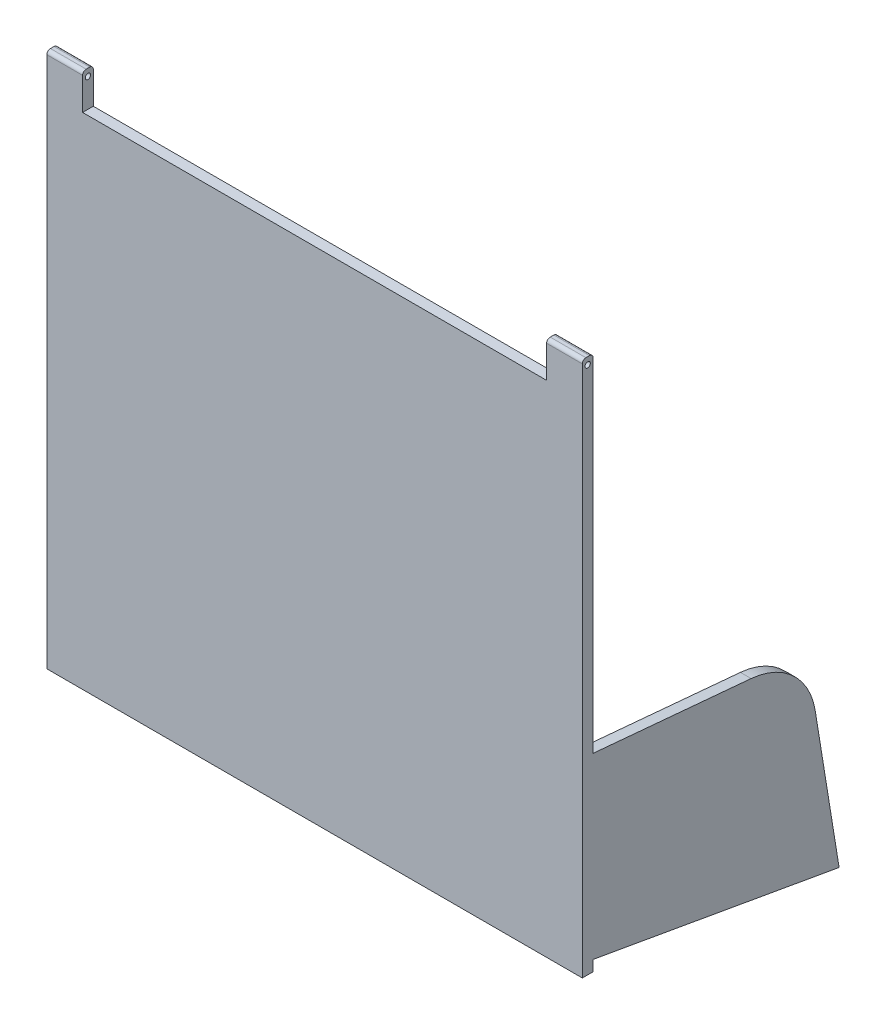
ISO-10303-21;
HEADER;
FILE_DESCRIPTION(('STEP AP214'),'2;1');
FILE_NAME('part.step','',(''),(''),'','','');
FILE_SCHEMA(('AUTOMOTIVE_DESIGN { 1 0 10303 214 1 1 1 1 }'));
ENDSEC;
DATA;
#1=APPLICATION_CONTEXT('core data for automotive mechanical design processes');
#2=APPLICATION_PROTOCOL_DEFINITION('international standard','automotive_design',2000,#1);
#3=PRODUCT_CONTEXT('',#1,'mechanical');
#4=PRODUCT('Part','Part','',(#3));
#5=PRODUCT_RELATED_PRODUCT_CATEGORY('part','',(#4));
#6=PRODUCT_DEFINITION_FORMATION('','',#4);
#7=PRODUCT_DEFINITION_CONTEXT('part definition',#1,'design');
#8=PRODUCT_DEFINITION('design','',#6,#7);
#9=PRODUCT_DEFINITION_SHAPE('','',#8);
#10=(LENGTH_UNIT() NAMED_UNIT(*) SI_UNIT(.MILLI.,.METRE.));
#11=(NAMED_UNIT(*) PLANE_ANGLE_UNIT() SI_UNIT($,.RADIAN.));
#12=(NAMED_UNIT(*) SI_UNIT($,.STERADIAN.) SOLID_ANGLE_UNIT());
#13=UNCERTAINTY_MEASURE_WITH_UNIT(LENGTH_MEASURE(1.E-05),#10,'distance_accuracy_value','');
#14=(GEOMETRIC_REPRESENTATION_CONTEXT(3) GLOBAL_UNCERTAINTY_ASSIGNED_CONTEXT((#13)) GLOBAL_UNIT_ASSIGNED_CONTEXT((#10,
#11,#12)) REPRESENTATION_CONTEXT('',''));
#15=CARTESIAN_POINT('',(0.,0.,0.));
#16=DIRECTION('',(0.,0.,1.));
#17=DIRECTION('',(1.,0.,0.));
#18=AXIS2_PLACEMENT_3D('',#15,#16,#17);
#19=CARTESIAN_POINT('',(0.,0.,3.));
#20=DIRECTION('',(1.,0.,0.));
#21=DIRECTION('',(0.,0.,-1.));
#22=AXIS2_PLACEMENT_3D('',#19,#20,#21);
#23=PLANE('',#22);
#24=DIRECTION('',(0.,-0.0898159250307496,-0.995958382469303));
#25=VECTOR('',#24,1.);
#26=CARTESIAN_POINT('',(0.,53.,0.));
#27=LINE('',#26,#25);
#28=CARTESIAN_POINT('',(0.,53.,0.));
#29=VERTEX_POINT('',#28);
#30=CARTESIAN_POINT('',(0.,49.0059654552923,-44.2893861340478));
#31=VERTEX_POINT('',#30);
#32=EDGE_CURVE('E190',#29,#31,#27,.T.);
#33=ORIENTED_EDGE('',*,*,#32,.T.);
#34=CARTESIAN_POINT('',(0.,29.0867978059063,-42.4930676334329));
#35=DIRECTION('',(1.,0.,0.));
#36=DIRECTION('',(0.,0.,-1.));
#37=AXIS2_PLACEMENT_3D('',#34,#35,#36);
#38=CIRCLE('',#37,20.);
#39=CARTESIAN_POINT('',(0.,32.2792992757854,-62.2366218819672));
#40=VERTEX_POINT('',#39);
#41=EDGE_CURVE('E357',#31,#40,#38,.F.);
#42=ORIENTED_EDGE('',*,*,#41,.T.);
#43=DIRECTION('',(0.,-0.987177712426718,-0.159625073493956));
#44=VECTOR('',#43,1.);
#45=CARTESIAN_POINT('',(0.,47.611044498155,-59.7575029481582));
#46=LINE('',#45,#44);
#47=CARTESIAN_POINT('',(0.,-9.15537243668538,-68.9365427108545));
#48=VERTEX_POINT('',#47);
#49=EDGE_CURVE('E215',#40,#48,#46,.T.);
#50=ORIENTED_EDGE('',*,*,#49,.T.);
#51=DIRECTION('',(0.,0.173648177666934,0.984807753012208));
#52=VECTOR('',#51,1.);
#53=CARTESIAN_POINT('',(0.,-9.15537243668538,-68.9365427108545));
#54=LINE('',#53,#52);
#55=CARTESIAN_POINT('',(0.,3.,0.));
#56=VERTEX_POINT('',#55);
#57=EDGE_CURVE('E213',#48,#56,#54,.T.);
#58=ORIENTED_EDGE('',*,*,#57,.T.);
#59=DIRECTION('',(0.,-1.,0.));
#60=VECTOR('',#59,1.);
#61=CARTESIAN_POINT('',(0.,0.,0.));
#62=LINE('',#61,#60);
#63=CARTESIAN_POINT('',(0.,0.,0.));
#64=VERTEX_POINT('',#63);
#65=EDGE_CURVE('E281',#56,#64,#62,.T.);
#66=ORIENTED_EDGE('',*,*,#65,.T.);
#67=DIRECTION('',(0.,0.,-1.));
#68=VECTOR('',#67,1.);
#69=CARTESIAN_POINT('',(0.,0.,3.));
#70=LINE('',#69,#68);
#71=CARTESIAN_POINT('',(0.,0.,3.));
#72=VERTEX_POINT('',#71);
#73=EDGE_CURVE('E313',#72,#64,#70,.T.);
#74=ORIENTED_EDGE('',*,*,#73,.F.);
#75=DIRECTION('',(0.,-1.,0.));
#76=VECTOR('',#75,1.);
#77=CARTESIAN_POINT('',(0.,0.,3.));
#78=LINE('',#77,#76);
#79=CARTESIAN_POINT('',(0.,149.,3.));
#80=VERTEX_POINT('',#79);
#81=EDGE_CURVE('E289',#80,#72,#78,.T.);
#82=ORIENTED_EDGE('',*,*,#81,.F.);
#83=CARTESIAN_POINT('',(0.,149.,2.));
#84=DIRECTION('',(1.,0.,0.));
#85=DIRECTION('',(0.,0.,-1.));
#86=AXIS2_PLACEMENT_3D('',#83,#84,#85);
#87=CIRCLE('',#86,1.);
#88=CARTESIAN_POINT('',(0.,150.,2.));
#89=VERTEX_POINT('',#88);
#90=EDGE_CURVE('E323',#80,#89,#87,.F.);
#91=ORIENTED_EDGE('',*,*,#90,.T.);
#92=DIRECTION('',(0.,0.,-1.));
#93=VECTOR('',#92,1.);
#94=CARTESIAN_POINT('',(0.,150.,3.));
#95=LINE('',#94,#93);
#96=CARTESIAN_POINT('',(0.,150.,1.));
#97=VERTEX_POINT('',#96);
#98=EDGE_CURVE('E297',#89,#97,#95,.T.);
#99=ORIENTED_EDGE('',*,*,#98,.T.);
#100=CARTESIAN_POINT('',(0.,149.,1.));
#101=DIRECTION('',(1.,0.,0.));
#102=DIRECTION('',(0.,0.,-1.));
#103=AXIS2_PLACEMENT_3D('',#100,#101,#102);
#104=CIRCLE('',#103,1.);
#105=CARTESIAN_POINT('',(0.,149.,0.));
#106=VERTEX_POINT('',#105);
#107=EDGE_CURVE('E325',#97,#106,#104,.F.);
#108=ORIENTED_EDGE('',*,*,#107,.T.);
#109=EDGE_CURVE('E298',#106,#29,#62,.T.);
#110=ORIENTED_EDGE('',*,*,#109,.T.);
#111=EDGE_LOOP('',(#33,#42,#50,#58,#66,#74,#82,#91,#99,#108,#110));
#112=FACE_BOUND('',#111,.T.);
#113=CARTESIAN_POINT('',(0.,148.,1.5));
#114=DIRECTION('',(1.,0.,0.));
#115=DIRECTION('',(0.,0.,-1.));
#116=AXIS2_PLACEMENT_3D('',#113,#114,#115);
#117=CIRCLE('',#116,0.75);
#118=CARTESIAN_POINT('',(0.,148.,0.749999999999999));
#119=VERTEX_POINT('',#118);
#120=EDGE_CURVE('E258',#119,#119,#117,.F.);
#121=ORIENTED_EDGE('',*,*,#120,.F.);
#122=EDGE_LOOP('',(#121));
#123=FACE_BOUND('',#122,.T.);
#124=ADVANCED_FACE('F36',(#112,#123),#23,.F.);
#125=CARTESIAN_POINT('',(150.,0.,3.));
#126=DIRECTION('',(-1.,0.,0.));
#127=DIRECTION('',(0.,-1.,0.));
#128=AXIS2_PLACEMENT_3D('',#125,#126,#127);
#129=PLANE('',#128);
#130=DIRECTION('',(0.,0.987177712426718,0.159625073493956));
#131=VECTOR('',#130,1.);
#132=CARTESIAN_POINT('',(150.,47.611044498155,-59.7575029481582));
#133=LINE('',#132,#131);
#134=CARTESIAN_POINT('',(150.,-9.15537243668538,-68.9365427108545));
#135=VERTEX_POINT('',#134);
#136=CARTESIAN_POINT('',(150.,32.2792992757854,-62.2366218819672));
#137=VERTEX_POINT('',#136);
#138=EDGE_CURVE('E241',#135,#137,#133,.T.);
#139=ORIENTED_EDGE('',*,*,#138,.T.);
#140=CARTESIAN_POINT('',(150.,29.0867978059063,-42.4930676334329));
#141=DIRECTION('',(-1.,0.,0.));
#142=DIRECTION('',(0.,-1.,0.));
#143=AXIS2_PLACEMENT_3D('',#140,#141,#142);
#144=CIRCLE('',#143,20.);
#145=CARTESIAN_POINT('',(150.,49.0059654552923,-44.2893861340478));
#146=VERTEX_POINT('',#145);
#147=EDGE_CURVE('E58',#137,#146,#144,.F.);
#148=ORIENTED_EDGE('',*,*,#147,.T.);
#149=DIRECTION('',(0.,0.0898159250307496,0.995958382469303));
#150=VECTOR('',#149,1.);
#151=CARTESIAN_POINT('',(150.,53.,0.));
#152=LINE('',#151,#150);
#153=CARTESIAN_POINT('',(150.,53.,0.));
#154=VERTEX_POINT('',#153);
#155=EDGE_CURVE('E230',#146,#154,#152,.T.);
#156=ORIENTED_EDGE('',*,*,#155,.T.);
#157=DIRECTION('',(0.,1.,0.));
#158=VECTOR('',#157,1.);
#159=CARTESIAN_POINT('',(150.,0.,0.));
#160=LINE('',#159,#158);
#161=CARTESIAN_POINT('',(150.,149.,0.));
#162=VERTEX_POINT('',#161);
#163=EDGE_CURVE('E302',#154,#162,#160,.T.);
#164=ORIENTED_EDGE('',*,*,#163,.T.);
#165=CARTESIAN_POINT('',(150.,149.,1.));
#166=DIRECTION('',(-1.,0.,0.));
#167=DIRECTION('',(0.,-1.,0.));
#168=AXIS2_PLACEMENT_3D('',#165,#166,#167);
#169=CIRCLE('',#168,1.);
#170=CARTESIAN_POINT('',(150.,150.,1.));
#171=VERTEX_POINT('',#170);
#172=EDGE_CURVE('E351',#162,#171,#169,.F.);
#173=ORIENTED_EDGE('',*,*,#172,.T.);
#174=DIRECTION('',(0.,0.,-1.));
#175=VECTOR('',#174,1.);
#176=CARTESIAN_POINT('',(150.,150.,3.));
#177=LINE('',#176,#175);
#178=CARTESIAN_POINT('',(150.,150.,2.));
#179=VERTEX_POINT('',#178);
#180=EDGE_CURVE('E307',#179,#171,#177,.T.);
#181=ORIENTED_EDGE('',*,*,#180,.F.);
#182=CARTESIAN_POINT('',(150.,149.,2.));
#183=DIRECTION('',(-1.,0.,0.));
#184=DIRECTION('',(0.,-1.,0.));
#185=AXIS2_PLACEMENT_3D('',#182,#183,#184);
#186=CIRCLE('',#185,1.);
#187=CARTESIAN_POINT('',(150.,149.,3.));
#188=VERTEX_POINT('',#187);
#189=EDGE_CURVE('E353',#179,#188,#186,.F.);
#190=ORIENTED_EDGE('',*,*,#189,.T.);
#191=DIRECTION('',(0.,1.,0.));
#192=VECTOR('',#191,1.);
#193=CARTESIAN_POINT('',(150.,0.,3.));
#194=LINE('',#193,#192);
#195=CARTESIAN_POINT('',(150.,0.,3.));
#196=VERTEX_POINT('',#195);
#197=EDGE_CURVE('E294',#196,#188,#194,.T.);
#198=ORIENTED_EDGE('',*,*,#197,.F.);
#199=DIRECTION('',(0.,0.,-1.));
#200=VECTOR('',#199,1.);
#201=CARTESIAN_POINT('',(150.,0.,3.));
#202=LINE('',#201,#200);
#203=CARTESIAN_POINT('',(150.,0.,0.));
#204=VERTEX_POINT('',#203);
#205=EDGE_CURVE('E310',#196,#204,#202,.T.);
#206=ORIENTED_EDGE('',*,*,#205,.T.);
#207=CARTESIAN_POINT('',(150.,3.,0.));
#208=VERTEX_POINT('',#207);
#209=EDGE_CURVE('E292',#204,#208,#160,.T.);
#210=ORIENTED_EDGE('',*,*,#209,.T.);
#211=DIRECTION('',(0.,-0.173648177666934,-0.984807753012208));
#212=VECTOR('',#211,1.);
#213=CARTESIAN_POINT('',(150.,3.,0.));
#214=LINE('',#213,#212);
#215=EDGE_CURVE('E223',#208,#135,#214,.T.);
#216=ORIENTED_EDGE('',*,*,#215,.T.);
#217=EDGE_LOOP('',(#139,#148,#156,#164,#173,#181,#190,#198,#206,#210,#216));
#218=FACE_BOUND('',#217,.T.);
#219=CARTESIAN_POINT('',(150.,148.,1.5));
#220=DIRECTION('',(-1.,0.,0.));
#221=DIRECTION('',(0.,-1.,0.));
#222=AXIS2_PLACEMENT_3D('',#219,#220,#221);
#223=CIRCLE('',#222,0.75);
#224=CARTESIAN_POINT('',(150.,147.25,1.5));
#225=VERTEX_POINT('',#224);
#226=EDGE_CURVE('E255',#225,#225,#223,.F.);
#227=ORIENTED_EDGE('',*,*,#226,.F.);
#228=EDGE_LOOP('',(#227));
#229=FACE_BOUND('',#228,.T.);
#230=ADVANCED_FACE('F372',(#218,#229),#129,.F.);
#231=CARTESIAN_POINT('',(10.,150.,0.));
#232=DIRECTION('',(-1.,0.,0.));
#233=DIRECTION('',(0.,-1.,0.));
#234=AXIS2_PLACEMENT_3D('',#231,#232,#233);
#235=PLANE('',#234);
#236=DIRECTION('',(0.,-1.,0.));
#237=VECTOR('',#236,1.);
#238=CARTESIAN_POINT('',(10.,150.,0.));
#239=LINE('',#238,#237);
#240=CARTESIAN_POINT('',(10.,149.,0.));
#241=VERTEX_POINT('',#240);
#242=CARTESIAN_POINT('',(10.,140.,0.));
#243=VERTEX_POINT('',#242);
#244=EDGE_CURVE('E262',#241,#243,#239,.T.);
#245=ORIENTED_EDGE('',*,*,#244,.F.);
#246=CARTESIAN_POINT('',(10.,149.,1.));
#247=DIRECTION('',(-1.,0.,0.));
#248=DIRECTION('',(0.,-1.,0.));
#249=AXIS2_PLACEMENT_3D('',#246,#247,#248);
#250=CIRCLE('',#249,1.);
#251=CARTESIAN_POINT('',(10.,150.,1.));
#252=VERTEX_POINT('',#251);
#253=EDGE_CURVE('E334',#241,#252,#250,.F.);
#254=ORIENTED_EDGE('',*,*,#253,.T.);
#255=DIRECTION('',(0.,0.,1.));
#256=VECTOR('',#255,1.);
#257=CARTESIAN_POINT('',(10.,150.,0.));
#258=LINE('',#257,#256);
#259=CARTESIAN_POINT('',(10.,150.,2.));
#260=VERTEX_POINT('',#259);
#261=EDGE_CURVE('E278',#252,#260,#258,.T.);
#262=ORIENTED_EDGE('',*,*,#261,.T.);
#263=CARTESIAN_POINT('',(10.,149.,2.));
#264=DIRECTION('',(-1.,0.,0.));
#265=DIRECTION('',(0.,-1.,0.));
#266=AXIS2_PLACEMENT_3D('',#263,#264,#265);
#267=CIRCLE('',#266,1.);
#268=CARTESIAN_POINT('',(10.,149.,3.));
#269=VERTEX_POINT('',#268);
#270=EDGE_CURVE('E332',#260,#269,#267,.F.);
#271=ORIENTED_EDGE('',*,*,#270,.T.);
#272=DIRECTION('',(0.,-1.,0.));
#273=VECTOR('',#272,1.);
#274=CARTESIAN_POINT('',(10.,150.,3.));
#275=LINE('',#274,#273);
#276=CARTESIAN_POINT('',(10.,140.,3.));
#277=VERTEX_POINT('',#276);
#278=EDGE_CURVE('E261',#269,#277,#275,.T.);
#279=ORIENTED_EDGE('',*,*,#278,.T.);
#280=DIRECTION('',(0.,0.,1.));
#281=VECTOR('',#280,1.);
#282=CARTESIAN_POINT('',(10.,140.,0.));
#283=LINE('',#282,#281);
#284=EDGE_CURVE('E271',#243,#277,#283,.T.);
#285=ORIENTED_EDGE('',*,*,#284,.F.);
#286=EDGE_LOOP('',(#245,#254,#262,#271,#279,#285));
#287=FACE_BOUND('',#286,.T.);
#288=CARTESIAN_POINT('',(10.,148.,1.5));
#289=DIRECTION('',(-1.,0.,0.));
#290=DIRECTION('',(0.,-1.,0.));
#291=AXIS2_PLACEMENT_3D('',#288,#289,#290);
#292=CIRCLE('',#291,0.75);
#293=CARTESIAN_POINT('',(10.,147.25,1.5));
#294=VERTEX_POINT('',#293);
#295=EDGE_CURVE('E252',#294,#294,#292,.F.);
#296=ORIENTED_EDGE('',*,*,#295,.F.);
#297=EDGE_LOOP('',(#296));
#298=FACE_BOUND('',#297,.T.);
#299=ADVANCED_FACE('F396',(#287,#298),#235,.F.);
#300=CARTESIAN_POINT('',(140.,150.,0.));
#301=DIRECTION('',(1.,0.,0.));
#302=DIRECTION('',(0.,0.,-1.));
#303=AXIS2_PLACEMENT_3D('',#300,#301,#302);
#304=PLANE('',#303);
#305=DIRECTION('',(0.,1.,0.));
#306=VECTOR('',#305,1.);
#307=CARTESIAN_POINT('',(140.,150.,3.));
#308=LINE('',#307,#306);
#309=CARTESIAN_POINT('',(140.,140.,3.));
#310=VERTEX_POINT('',#309);
#311=CARTESIAN_POINT('',(140.,149.,3.));
#312=VERTEX_POINT('',#311);
#313=EDGE_CURVE('E265',#310,#312,#308,.T.);
#314=ORIENTED_EDGE('',*,*,#313,.T.);
#315=CARTESIAN_POINT('',(140.,149.,2.));
#316=DIRECTION('',(1.,0.,0.));
#317=DIRECTION('',(0.,0.,-1.));
#318=AXIS2_PLACEMENT_3D('',#315,#316,#317);
#319=CIRCLE('',#318,1.);
#320=CARTESIAN_POINT('',(140.,150.,2.));
#321=VERTEX_POINT('',#320);
#322=EDGE_CURVE('E344',#312,#321,#319,.F.);
#323=ORIENTED_EDGE('',*,*,#322,.T.);
#324=DIRECTION('',(0.,0.,1.));
#325=VECTOR('',#324,1.);
#326=CARTESIAN_POINT('',(140.,150.,0.));
#327=LINE('',#326,#325);
#328=CARTESIAN_POINT('',(140.,150.,1.));
#329=VERTEX_POINT('',#328);
#330=EDGE_CURVE('E282',#329,#321,#327,.T.);
#331=ORIENTED_EDGE('',*,*,#330,.F.);
#332=CARTESIAN_POINT('',(140.,149.,1.));
#333=DIRECTION('',(1.,0.,0.));
#334=DIRECTION('',(0.,0.,-1.));
#335=AXIS2_PLACEMENT_3D('',#332,#333,#334);
#336=CIRCLE('',#335,1.);
#337=CARTESIAN_POINT('',(140.,149.,0.));
#338=VERTEX_POINT('',#337);
#339=EDGE_CURVE('E342',#329,#338,#336,.F.);
#340=ORIENTED_EDGE('',*,*,#339,.T.);
#341=DIRECTION('',(0.,1.,0.));
#342=VECTOR('',#341,1.);
#343=CARTESIAN_POINT('',(140.,150.,0.));
#344=LINE('',#343,#342);
#345=CARTESIAN_POINT('',(140.,140.,0.));
#346=VERTEX_POINT('',#345);
#347=EDGE_CURVE('E268',#346,#338,#344,.T.);
#348=ORIENTED_EDGE('',*,*,#347,.F.);
#349=DIRECTION('',(0.,0.,1.));
#350=VECTOR('',#349,1.);
#351=CARTESIAN_POINT('',(140.,140.,0.));
#352=LINE('',#351,#350);
#353=EDGE_CURVE('E285',#346,#310,#352,.T.);
#354=ORIENTED_EDGE('',*,*,#353,.T.);
#355=EDGE_LOOP('',(#314,#323,#331,#340,#348,#354));
#356=FACE_BOUND('',#355,.T.);
#357=CARTESIAN_POINT('',(140.,148.,1.5));
#358=DIRECTION('',(1.,0.,0.));
#359=DIRECTION('',(0.,0.,-1.));
#360=AXIS2_PLACEMENT_3D('',#357,#358,#359);
#361=CIRCLE('',#360,0.75);
#362=CARTESIAN_POINT('',(140.,148.,0.749999999999999));
#363=VERTEX_POINT('',#362);
#364=EDGE_CURVE('E247',#363,#363,#361,.F.);
#365=ORIENTED_EDGE('',*,*,#364,.F.);
#366=EDGE_LOOP('',(#365));
#367=FACE_BOUND('',#366,.T.);
#368=ADVANCED_FACE('F470',(#356,#367),#304,.F.);
#369=CARTESIAN_POINT('',(0.,150.,3.));
#370=DIRECTION('',(0.,-1.,0.));
#371=DIRECTION('',(0.,0.,-1.));
#372=AXIS2_PLACEMENT_3D('',#369,#370,#371);
#373=PLANE('',#372);
#374=ORIENTED_EDGE('',*,*,#261,.F.);
#375=DIRECTION('',(-1.,0.,0.));
#376=VECTOR('',#375,1.);
#377=CARTESIAN_POINT('',(0.,150.,1.));
#378=LINE('',#377,#376);
#379=EDGE_CURVE('E320',#252,#97,#378,.T.);
#380=ORIENTED_EDGE('',*,*,#379,.T.);
#381=ORIENTED_EDGE('',*,*,#98,.F.);
#382=DIRECTION('',(-1.,0.,0.));
#383=VECTOR('',#382,1.);
#384=CARTESIAN_POINT('',(0.,150.,2.));
#385=LINE('',#384,#383);
#386=EDGE_CURVE('E316',#89,#260,#385,.F.);
#387=ORIENTED_EDGE('',*,*,#386,.T.);
#388=EDGE_LOOP('',(#374,#380,#381,#387));
#389=FACE_BOUND('',#388,.T.);
#390=ADVANCED_FACE('F460',(#389),#373,.F.);
#391=CARTESIAN_POINT('',(0.,0.,3.));
#392=DIRECTION('',(0.,1.,0.));
#393=DIRECTION('',(0.,0.,1.));
#394=AXIS2_PLACEMENT_3D('',#391,#392,#393);
#395=PLANE('',#394);
#396=DIRECTION('',(1.,0.,0.));
#397=VECTOR('',#396,1.);
#398=CARTESIAN_POINT('',(0.,0.,0.));
#399=LINE('',#398,#397);
#400=EDGE_CURVE('E300',#64,#204,#399,.T.);
#401=ORIENTED_EDGE('',*,*,#400,.T.);
#402=ORIENTED_EDGE('',*,*,#205,.F.);
#403=DIRECTION('',(1.,0.,0.));
#404=VECTOR('',#403,1.);
#405=CARTESIAN_POINT('',(0.,0.,3.));
#406=LINE('',#405,#404);
#407=EDGE_CURVE('E291',#72,#196,#406,.T.);
#408=ORIENTED_EDGE('',*,*,#407,.F.);
#409=ORIENTED_EDGE('',*,*,#73,.T.);
#410=EDGE_LOOP('',(#401,#402,#408,#409));
#411=FACE_BOUND('',#410,.T.);
#412=ADVANCED_FACE('F401',(#411),#395,.F.);
#413=ORIENTED_EDGE('',*,*,#330,.T.);
#414=DIRECTION('',(-1.,0.,0.));
#415=VECTOR('',#414,1.);
#416=CARTESIAN_POINT('',(0.,150.,2.));
#417=LINE('',#416,#415);
#418=EDGE_CURVE('E349',#321,#179,#417,.F.);
#419=ORIENTED_EDGE('',*,*,#418,.T.);
#420=ORIENTED_EDGE('',*,*,#180,.T.);
#421=DIRECTION('',(-1.,0.,0.));
#422=VECTOR('',#421,1.);
#423=CARTESIAN_POINT('',(140.,150.,1.));
#424=LINE('',#423,#422);
#425=EDGE_CURVE('E346',#171,#329,#424,.T.);
#426=ORIENTED_EDGE('',*,*,#425,.T.);
#427=EDGE_LOOP('',(#413,#419,#420,#426));
#428=FACE_BOUND('',#427,.T.);
#429=ADVANCED_FACE('F429',(#428),#373,.F.);
#430=CARTESIAN_POINT('',(0.,0.,3.));
#431=DIRECTION('',(0.,0.,-1.));
#432=DIRECTION('',(-1.,0.,0.));
#433=AXIS2_PLACEMENT_3D('',#430,#431,#432);
#434=PLANE('',#433);
#435=ORIENTED_EDGE('',*,*,#278,.F.);
#436=DIRECTION('',(-1.,0.,0.));
#437=VECTOR('',#436,1.);
#438=CARTESIAN_POINT('',(0.,149.,3.));
#439=LINE('',#438,#437);
#440=EDGE_CURVE('E339',#269,#80,#439,.T.);
#441=ORIENTED_EDGE('',*,*,#440,.T.);
#442=ORIENTED_EDGE('',*,*,#81,.T.);
#443=ORIENTED_EDGE('',*,*,#407,.T.);
#444=ORIENTED_EDGE('',*,*,#197,.T.);
#445=DIRECTION('',(-1.,0.,0.));
#446=VECTOR('',#445,1.);
#447=CARTESIAN_POINT('',(0.,149.,3.));
#448=LINE('',#447,#446);
#449=EDGE_CURVE('E336',#188,#312,#448,.T.);
#450=ORIENTED_EDGE('',*,*,#449,.T.);
#451=ORIENTED_EDGE('',*,*,#313,.F.);
#452=DIRECTION('',(1.,0.,0.));
#453=VECTOR('',#452,1.);
#454=CARTESIAN_POINT('',(10.,140.,3.));
#455=LINE('',#454,#453);
#456=EDGE_CURVE('E273',#277,#310,#455,.T.);
#457=ORIENTED_EDGE('',*,*,#456,.F.);
#458=EDGE_LOOP('',(#435,#441,#442,#443,#444,#450,#451,#457));
#459=FACE_BOUND('',#458,.T.);
#460=ADVANCED_FACE('F436',(#459),#434,.F.);
#461=CARTESIAN_POINT('',(0.,0.,0.));
#462=DIRECTION('',(0.,0.,-1.));
#463=DIRECTION('',(-1.,0.,0.));
#464=AXIS2_PLACEMENT_3D('',#461,#462,#463);
#465=PLANE('',#464);
#466=DIRECTION('',(-1.,0.,0.));
#467=VECTOR('',#466,1.);
#468=CARTESIAN_POINT('',(3.,3.,0.));
#469=LINE('',#468,#467);
#470=CARTESIAN_POINT('',(3.,3.,0.));
#471=VERTEX_POINT('',#470);
#472=EDGE_CURVE('E212',#471,#56,#469,.T.);
#473=ORIENTED_EDGE('',*,*,#472,.F.);
#474=DIRECTION('',(0.,1.,0.));
#475=VECTOR('',#474,1.);
#476=CARTESIAN_POINT('',(3.,3.,0.));
#477=LINE('',#476,#475);
#478=CARTESIAN_POINT('',(3.,53.,0.));
#479=VERTEX_POINT('',#478);
#480=EDGE_CURVE('E202',#471,#479,#477,.T.);
#481=ORIENTED_EDGE('',*,*,#480,.T.);
#482=DIRECTION('',(-1.,0.,0.));
#483=VECTOR('',#482,1.);
#484=CARTESIAN_POINT('',(3.,53.,0.));
#485=LINE('',#484,#483);
#486=EDGE_CURVE('E183',#479,#29,#485,.T.);
#487=ORIENTED_EDGE('',*,*,#486,.T.);
#488=ORIENTED_EDGE('',*,*,#109,.F.);
#489=DIRECTION('',(-1.,0.,0.));
#490=VECTOR('',#489,1.);
#491=CARTESIAN_POINT('',(10.,149.,0.));
#492=LINE('',#491,#490);
#493=EDGE_CURVE('E330',#106,#241,#492,.F.);
#494=ORIENTED_EDGE('',*,*,#493,.T.);
#495=ORIENTED_EDGE('',*,*,#244,.T.);
#496=DIRECTION('',(1.,0.,0.));
#497=VECTOR('',#496,1.);
#498=CARTESIAN_POINT('',(10.,140.,0.));
#499=LINE('',#498,#497);
#500=EDGE_CURVE('E264',#243,#346,#499,.T.);
#501=ORIENTED_EDGE('',*,*,#500,.T.);
#502=ORIENTED_EDGE('',*,*,#347,.T.);
#503=DIRECTION('',(-1.,0.,0.));
#504=VECTOR('',#503,1.);
#505=CARTESIAN_POINT('',(150.,149.,0.));
#506=LINE('',#505,#504);
#507=EDGE_CURVE('E327',#338,#162,#506,.F.);
#508=ORIENTED_EDGE('',*,*,#507,.T.);
#509=ORIENTED_EDGE('',*,*,#163,.F.);
#510=DIRECTION('',(1.,0.,0.));
#511=VECTOR('',#510,1.);
#512=CARTESIAN_POINT('',(147.,53.,0.));
#513=LINE('',#512,#511);
#514=CARTESIAN_POINT('',(147.,53.,0.));
#515=VERTEX_POINT('',#514);
#516=EDGE_CURVE('E244',#515,#154,#513,.T.);
#517=ORIENTED_EDGE('',*,*,#516,.F.);
#518=DIRECTION('',(0.,-1.,0.));
#519=VECTOR('',#518,1.);
#520=CARTESIAN_POINT('',(147.,53.,0.));
#521=LINE('',#520,#519);
#522=CARTESIAN_POINT('',(147.,3.,0.));
#523=VERTEX_POINT('',#522);
#524=EDGE_CURVE('E226',#515,#523,#521,.T.);
#525=ORIENTED_EDGE('',*,*,#524,.T.);
#526=DIRECTION('',(1.,0.,0.));
#527=VECTOR('',#526,1.);
#528=CARTESIAN_POINT('',(147.,3.,0.));
#529=LINE('',#528,#527);
#530=EDGE_CURVE('E238',#523,#208,#529,.T.);
#531=ORIENTED_EDGE('',*,*,#530,.T.);
#532=ORIENTED_EDGE('',*,*,#209,.F.);
#533=ORIENTED_EDGE('',*,*,#400,.F.);
#534=ORIENTED_EDGE('',*,*,#65,.F.);
#535=EDGE_LOOP('',(#473,#481,#487,#488,#494,#495,#501,#502,#508,#509,#517,#525,#531,#532,#533,#534));
#536=FACE_BOUND('',#535,.T.);
#537=ADVANCED_FACE('F209',(#536),#465,.T.);
#538=CARTESIAN_POINT('',(10.,140.,0.));
#539=DIRECTION('',(0.,-1.,0.));
#540=DIRECTION('',(0.,0.,-1.));
#541=AXIS2_PLACEMENT_3D('',#538,#539,#540);
#542=PLANE('',#541);
#543=ORIENTED_EDGE('',*,*,#456,.T.);
#544=ORIENTED_EDGE('',*,*,#353,.F.);
#545=ORIENTED_EDGE('',*,*,#500,.F.);
#546=ORIENTED_EDGE('',*,*,#284,.T.);
#547=EDGE_LOOP('',(#543,#544,#545,#546));
#548=FACE_BOUND('',#547,.T.);
#549=ADVANCED_FACE('F467',(#548),#542,.F.);
#550=CARTESIAN_POINT('',(163.,148.,1.5));
#551=DIRECTION('',(-1.,0.,0.));
#552=DIRECTION('',(0.,-1.,0.));
#553=AXIS2_PLACEMENT_3D('',#550,#551,#552);
#554=CYLINDRICAL_SURFACE('',#553,0.75);
#555=ORIENTED_EDGE('',*,*,#364,.T.);
#556=EDGE_LOOP('',(#555));
#557=FACE_BOUND('',#556,.T.);
#558=ORIENTED_EDGE('',*,*,#226,.T.);
#559=EDGE_LOOP('',(#558));
#560=FACE_BOUND('',#559,.T.);
#561=ADVANCED_FACE('F476',(#557,#560),#554,.F.);
#562=ORIENTED_EDGE('',*,*,#295,.T.);
#563=EDGE_LOOP('',(#562));
#564=FACE_BOUND('',#563,.T.);
#565=ORIENTED_EDGE('',*,*,#120,.T.);
#566=EDGE_LOOP('',(#565));
#567=FACE_BOUND('',#566,.T.);
#568=ADVANCED_FACE('F406',(#564,#567),#554,.F.);
#569=CARTESIAN_POINT('',(0.,149.,1.));
#570=DIRECTION('',(1.,0.,0.));
#571=DIRECTION('',(0.,0.,-1.));
#572=AXIS2_PLACEMENT_3D('',#569,#570,#571);
#573=CYLINDRICAL_SURFACE('',#572,1.);
#574=ORIENTED_EDGE('',*,*,#253,.F.);
#575=ORIENTED_EDGE('',*,*,#493,.F.);
#576=ORIENTED_EDGE('',*,*,#107,.F.);
#577=ORIENTED_EDGE('',*,*,#379,.F.);
#578=EDGE_LOOP('',(#574,#575,#576,#577));
#579=FACE_BOUND('',#578,.T.);
#580=ADVANCED_FACE('F402',(#579),#573,.T.);
#581=CARTESIAN_POINT('',(0.,149.,2.));
#582=DIRECTION('',(-1.,0.,0.));
#583=DIRECTION('',(0.,0.,1.));
#584=AXIS2_PLACEMENT_3D('',#581,#582,#583);
#585=CYLINDRICAL_SURFACE('',#584,1.);
#586=ORIENTED_EDGE('',*,*,#270,.F.);
#587=ORIENTED_EDGE('',*,*,#386,.F.);
#588=ORIENTED_EDGE('',*,*,#90,.F.);
#589=ORIENTED_EDGE('',*,*,#440,.F.);
#590=EDGE_LOOP('',(#586,#587,#588,#589));
#591=FACE_BOUND('',#590,.T.);
#592=ADVANCED_FACE('F405',(#591),#585,.T.);
#593=CARTESIAN_POINT('',(0.,149.,2.));
#594=DIRECTION('',(-1.,0.,0.));
#595=DIRECTION('',(0.,0.,1.));
#596=AXIS2_PLACEMENT_3D('',#593,#594,#595);
#597=CYLINDRICAL_SURFACE('',#596,1.);
#598=ORIENTED_EDGE('',*,*,#189,.F.);
#599=ORIENTED_EDGE('',*,*,#418,.F.);
#600=ORIENTED_EDGE('',*,*,#322,.F.);
#601=ORIENTED_EDGE('',*,*,#449,.F.);
#602=EDGE_LOOP('',(#598,#599,#600,#601));
#603=FACE_BOUND('',#602,.T.);
#604=ADVANCED_FACE('F410',(#603),#597,.T.);
#605=CARTESIAN_POINT('',(0.,149.,1.));
#606=DIRECTION('',(1.,0.,0.));
#607=DIRECTION('',(0.,0.,-1.));
#608=AXIS2_PLACEMENT_3D('',#605,#606,#607);
#609=CYLINDRICAL_SURFACE('',#608,1.);
#610=ORIENTED_EDGE('',*,*,#172,.F.);
#611=ORIENTED_EDGE('',*,*,#507,.F.);
#612=ORIENTED_EDGE('',*,*,#339,.F.);
#613=ORIENTED_EDGE('',*,*,#425,.F.);
#614=EDGE_LOOP('',(#610,#611,#612,#613));
#615=FACE_BOUND('',#614,.T.);
#616=ADVANCED_FACE('F414',(#615),#609,.T.);
#617=CARTESIAN_POINT('',(147.,53.,0.));
#618=DIRECTION('',(0.,0.995958382469303,-0.0898159250307496));
#619=DIRECTION('',(0.,0.0898159250307496,0.995958382469303));
#620=AXIS2_PLACEMENT_3D('',#617,#618,#619);
#621=PLANE('',#620);
#622=ORIENTED_EDGE('',*,*,#155,.F.);
#623=DIRECTION('',(1.,0.,0.));
#624=VECTOR('',#623,1.);
#625=CARTESIAN_POINT('',(147.,49.0059654552923,-44.2893861340478));
#626=LINE('',#625,#624);
#627=CARTESIAN_POINT('',(147.,49.0059654552923,-44.2893861340478));
#628=VERTEX_POINT('',#627);
#629=EDGE_CURVE('E44',#146,#628,#626,.F.);
#630=ORIENTED_EDGE('',*,*,#629,.T.);
#631=DIRECTION('',(0.,0.0898159250307496,0.995958382469303));
#632=VECTOR('',#631,1.);
#633=CARTESIAN_POINT('',(147.,53.,0.));
#634=LINE('',#633,#632);
#635=EDGE_CURVE('E236',#628,#515,#634,.T.);
#636=ORIENTED_EDGE('',*,*,#635,.T.);
#637=ORIENTED_EDGE('',*,*,#516,.T.);
#638=EDGE_LOOP('',(#622,#630,#636,#637));
#639=FACE_BOUND('',#638,.T.);
#640=ADVANCED_FACE('F417',(#639),#621,.T.);
#641=CARTESIAN_POINT('',(147.,47.611044498155,-59.7575029481582));
#642=DIRECTION('',(0.,0.159625073493956,-0.987177712426718));
#643=DIRECTION('',(0.,0.987177712426719,0.159625073493956));
#644=AXIS2_PLACEMENT_3D('',#641,#642,#643);
#645=PLANE('',#644);
#646=DIRECTION('',(0.,0.987177712426718,0.159625073493956));
#647=VECTOR('',#646,1.);
#648=CARTESIAN_POINT('',(147.,47.611044498155,-59.7575029481582));
#649=LINE('',#648,#647);
#650=CARTESIAN_POINT('',(147.,-9.15537243668538,-68.9365427108545));
#651=VERTEX_POINT('',#650);
#652=CARTESIAN_POINT('',(147.,32.2792992757854,-62.2366218819672));
#653=VERTEX_POINT('',#652);
#654=EDGE_CURVE('E233',#651,#653,#649,.T.);
#655=ORIENTED_EDGE('',*,*,#654,.T.);
#656=DIRECTION('',(1.,0.,0.));
#657=VECTOR('',#656,1.);
#658=CARTESIAN_POINT('',(147.,32.2792992757854,-62.2366218819672));
#659=LINE('',#658,#657);
#660=EDGE_CURVE('E362',#653,#137,#659,.T.);
#661=ORIENTED_EDGE('',*,*,#660,.T.);
#662=ORIENTED_EDGE('',*,*,#138,.F.);
#663=DIRECTION('',(1.,0.,0.));
#664=VECTOR('',#663,1.);
#665=CARTESIAN_POINT('',(147.,-9.15537243668538,-68.9365427108545));
#666=LINE('',#665,#664);
#667=EDGE_CURVE('E248',#651,#135,#666,.T.);
#668=ORIENTED_EDGE('',*,*,#667,.F.);
#669=EDGE_LOOP('',(#655,#661,#662,#668));
#670=FACE_BOUND('',#669,.T.);
#671=ADVANCED_FACE('F368',(#670),#645,.T.);
#672=CARTESIAN_POINT('',(147.,3.,0.));
#673=DIRECTION('',(0.,-0.984807753012207,0.173648177666934));
#674=DIRECTION('',(0.,-0.173648177666934,-0.984807753012208));
#675=AXIS2_PLACEMENT_3D('',#672,#673,#674);
#676=PLANE('',#675);
#677=ORIENTED_EDGE('',*,*,#215,.F.);
#678=ORIENTED_EDGE('',*,*,#530,.F.);
#679=DIRECTION('',(0.,-0.173648177666934,-0.984807753012208));
#680=VECTOR('',#679,1.);
#681=CARTESIAN_POINT('',(147.,3.,0.));
#682=LINE('',#681,#680);
#683=EDGE_CURVE('E229',#523,#651,#682,.T.);
#684=ORIENTED_EDGE('',*,*,#683,.T.);
#685=ORIENTED_EDGE('',*,*,#667,.T.);
#686=EDGE_LOOP('',(#677,#678,#684,#685));
#687=FACE_BOUND('',#686,.T.);
#688=ADVANCED_FACE('F376',(#687),#676,.T.);
#689=CARTESIAN_POINT('',(147.,0.,0.));
#690=DIRECTION('',(1.,0.,0.));
#691=DIRECTION('',(0.,0.,-1.));
#692=AXIS2_PLACEMENT_3D('',#689,#690,#691);
#693=PLANE('',#692);
#694=ORIENTED_EDGE('',*,*,#635,.F.);
#695=CARTESIAN_POINT('',(147.,29.0867978059063,-42.4930676334329));
#696=DIRECTION('',(1.,0.,0.));
#697=DIRECTION('',(0.,0.,-1.));
#698=AXIS2_PLACEMENT_3D('',#695,#696,#697);
#699=CIRCLE('',#698,20.);
#700=EDGE_CURVE('E11',#628,#653,#699,.F.);
#701=ORIENTED_EDGE('',*,*,#700,.T.);
#702=ORIENTED_EDGE('',*,*,#654,.F.);
#703=ORIENTED_EDGE('',*,*,#683,.F.);
#704=ORIENTED_EDGE('',*,*,#524,.F.);
#705=EDGE_LOOP('',(#694,#701,#702,#703,#704));
#706=FACE_BOUND('',#705,.T.);
#707=ADVANCED_FACE('F383',(#706),#693,.F.);
#708=CARTESIAN_POINT('',(3.,-9.15537243668538,-68.9365427108545));
#709=DIRECTION('',(0.,-0.984807753012207,0.173648177666934));
#710=DIRECTION('',(0.,-0.173648177666934,-0.984807753012208));
#711=AXIS2_PLACEMENT_3D('',#708,#709,#710);
#712=PLANE('',#711);
#713=ORIENTED_EDGE('',*,*,#57,.F.);
#714=DIRECTION('',(-1.,0.,0.));
#715=VECTOR('',#714,1.);
#716=CARTESIAN_POINT('',(3.,-9.15537243668538,-68.9365427108545));
#717=LINE('',#716,#715);
#718=CARTESIAN_POINT('',(3.,-9.15537243668538,-68.9365427108545));
#719=VERTEX_POINT('',#718);
#720=EDGE_CURVE('E195',#719,#48,#717,.T.);
#721=ORIENTED_EDGE('',*,*,#720,.F.);
#722=DIRECTION('',(0.,0.173648177666934,0.984807753012208));
#723=VECTOR('',#722,1.);
#724=CARTESIAN_POINT('',(3.,-9.15537243668538,-68.9365427108545));
#725=LINE('',#724,#723);
#726=EDGE_CURVE('E196',#719,#471,#725,.T.);
#727=ORIENTED_EDGE('',*,*,#726,.T.);
#728=ORIENTED_EDGE('',*,*,#472,.T.);
#729=EDGE_LOOP('',(#713,#721,#727,#728));
#730=FACE_BOUND('',#729,.T.);
#731=ADVANCED_FACE('F447',(#730),#712,.T.);
#732=CARTESIAN_POINT('',(3.,47.611044498155,-59.7575029481582));
#733=DIRECTION('',(0.,0.159625073493956,-0.987177712426718));
#734=DIRECTION('',(0.,0.987177712426719,0.159625073493956));
#735=AXIS2_PLACEMENT_3D('',#732,#733,#734);
#736=PLANE('',#735);
#737=ORIENTED_EDGE('',*,*,#49,.F.);
#738=DIRECTION('',(-1.,0.,0.));
#739=VECTOR('',#738,1.);
#740=CARTESIAN_POINT('',(3.,32.2792992757854,-62.2366218819672));
#741=LINE('',#740,#739);
#742=CARTESIAN_POINT('',(3.,32.2792992757854,-62.2366218819672));
#743=VERTEX_POINT('',#742);
#744=EDGE_CURVE('E359',#40,#743,#741,.F.);
#745=ORIENTED_EDGE('',*,*,#744,.T.);
#746=DIRECTION('',(0.,-0.987177712426718,-0.159625073493956));
#747=VECTOR('',#746,1.);
#748=CARTESIAN_POINT('',(3.,47.611044498155,-59.7575029481582));
#749=LINE('',#748,#747);
#750=EDGE_CURVE('E206',#743,#719,#749,.T.);
#751=ORIENTED_EDGE('',*,*,#750,.T.);
#752=ORIENTED_EDGE('',*,*,#720,.T.);
#753=EDGE_LOOP('',(#737,#745,#751,#752));
#754=FACE_BOUND('',#753,.T.);
#755=ADVANCED_FACE('F578',(#754),#736,.T.);
#756=CARTESIAN_POINT('',(3.,53.,0.));
#757=DIRECTION('',(0.,0.995958382469303,-0.0898159250307496));
#758=DIRECTION('',(0.,0.0898159250307496,0.995958382469303));
#759=AXIS2_PLACEMENT_3D('',#756,#757,#758);
#760=PLANE('',#759);
#761=DIRECTION('',(0.,-0.0898159250307496,-0.995958382469303));
#762=VECTOR('',#761,1.);
#763=CARTESIAN_POINT('',(3.,53.,0.));
#764=LINE('',#763,#762);
#765=CARTESIAN_POINT('',(3.,49.0059654552923,-44.2893861340478));
#766=VERTEX_POINT('',#765);
#767=EDGE_CURVE('E187',#479,#766,#764,.T.);
#768=ORIENTED_EDGE('',*,*,#767,.T.);
#769=DIRECTION('',(-1.,0.,0.));
#770=VECTOR('',#769,1.);
#771=CARTESIAN_POINT('',(3.,49.0059654552923,-44.2893861340478));
#772=LINE('',#771,#770);
#773=EDGE_CURVE('E355',#766,#31,#772,.T.);
#774=ORIENTED_EDGE('',*,*,#773,.T.);
#775=ORIENTED_EDGE('',*,*,#32,.F.);
#776=ORIENTED_EDGE('',*,*,#486,.F.);
#777=EDGE_LOOP('',(#768,#774,#775,#776));
#778=FACE_BOUND('',#777,.T.);
#779=ADVANCED_FACE('F185',(#778),#760,.T.);
#780=CARTESIAN_POINT('',(3.,0.,0.));
#781=DIRECTION('',(-1.,0.,0.));
#782=DIRECTION('',(0.,0.,1.));
#783=AXIS2_PLACEMENT_3D('',#780,#781,#782);
#784=PLANE('',#783);
#785=ORIENTED_EDGE('',*,*,#750,.F.);
#786=CARTESIAN_POINT('',(3.,29.0867978059063,-42.4930676334329));
#787=DIRECTION('',(-1.,0.,0.));
#788=DIRECTION('',(0.,0.,1.));
#789=AXIS2_PLACEMENT_3D('',#786,#787,#788);
#790=CIRCLE('',#789,20.);
#791=EDGE_CURVE('E205',#743,#766,#790,.F.);
#792=ORIENTED_EDGE('',*,*,#791,.T.);
#793=ORIENTED_EDGE('',*,*,#767,.F.);
#794=ORIENTED_EDGE('',*,*,#480,.F.);
#795=ORIENTED_EDGE('',*,*,#726,.F.);
#796=EDGE_LOOP('',(#785,#792,#793,#794,#795));
#797=FACE_BOUND('',#796,.T.);
#798=ADVANCED_FACE('F200',(#797),#784,.F.);
#799=CARTESIAN_POINT('',(3.,29.0867978059063,-42.4930676334329));
#800=DIRECTION('',(-1.,0.,0.));
#801=DIRECTION('',(0.,0.,1.));
#802=AXIS2_PLACEMENT_3D('',#799,#800,#801);
#803=CYLINDRICAL_SURFACE('',#802,20.);
#804=ORIENTED_EDGE('',*,*,#791,.F.);
#805=ORIENTED_EDGE('',*,*,#744,.F.);
#806=ORIENTED_EDGE('',*,*,#41,.F.);
#807=ORIENTED_EDGE('',*,*,#773,.F.);
#808=EDGE_LOOP('',(#804,#805,#806,#807));
#809=FACE_BOUND('',#808,.T.);
#810=ADVANCED_FACE('F385',(#809),#803,.T.);
#811=CARTESIAN_POINT('',(147.,29.0867978059063,-42.4930676334329));
#812=DIRECTION('',(1.,0.,0.));
#813=DIRECTION('',(0.,1.,0.));
#814=AXIS2_PLACEMENT_3D('',#811,#812,#813);
#815=CYLINDRICAL_SURFACE('',#814,20.);
#816=ORIENTED_EDGE('',*,*,#700,.F.);
#817=ORIENTED_EDGE('',*,*,#629,.F.);
#818=ORIENTED_EDGE('',*,*,#147,.F.);
#819=ORIENTED_EDGE('',*,*,#660,.F.);
#820=EDGE_LOOP('',(#816,#817,#818,#819));
#821=FACE_BOUND('',#820,.T.);
#822=ADVANCED_FACE('F38',(#821),#815,.T.);
#823=CLOSED_SHELL('',(#124,#230,#299,#368,#390,#412,#429,#460,#537,#549,#561,#568,#580,#592,
#604,#616,#640,#671,#688,#707,#731,#755,#779,#798,#810,#822));
#824=MANIFOLD_SOLID_BREP('B2',#823);
#825=ADVANCED_BREP_SHAPE_REPRESENTATION('',(#18,#824),#14);
#826=SHAPE_DEFINITION_REPRESENTATION(#9,#825);
ENDSEC;
END-ISO-10303-21;
